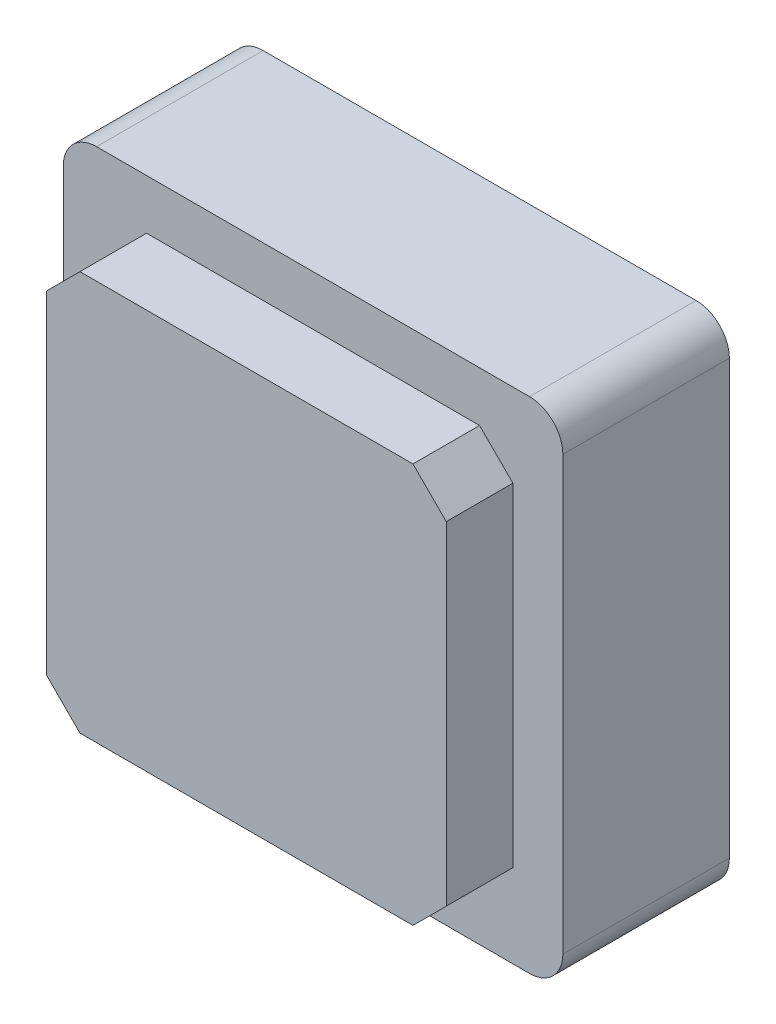
ISO-10303-21;
HEADER;
FILE_DESCRIPTION(('STEP AP214'),'2;1');
FILE_NAME('part.step','',(''),(''),'','','');
FILE_SCHEMA(('AUTOMOTIVE_DESIGN { 1 0 10303 214 1 1 1 1 }'));
ENDSEC;
DATA;
#1=APPLICATION_CONTEXT('core data for automotive mechanical design processes');
#2=APPLICATION_PROTOCOL_DEFINITION('international standard','automotive_design',2000,#1);
#3=PRODUCT_CONTEXT('',#1,'mechanical');
#4=PRODUCT('Part','Part','',(#3));
#5=PRODUCT_RELATED_PRODUCT_CATEGORY('part','',(#4));
#6=PRODUCT_DEFINITION_FORMATION('','',#4);
#7=PRODUCT_DEFINITION_CONTEXT('part definition',#1,'design');
#8=PRODUCT_DEFINITION('design','',#6,#7);
#9=PRODUCT_DEFINITION_SHAPE('','',#8);
#10=(LENGTH_UNIT() NAMED_UNIT(*) SI_UNIT(.MILLI.,.METRE.));
#11=(NAMED_UNIT(*) PLANE_ANGLE_UNIT() SI_UNIT($,.RADIAN.));
#12=(NAMED_UNIT(*) SI_UNIT($,.STERADIAN.) SOLID_ANGLE_UNIT());
#13=UNCERTAINTY_MEASURE_WITH_UNIT(LENGTH_MEASURE(1.E-05),#10,'distance_accuracy_value','');
#14=(GEOMETRIC_REPRESENTATION_CONTEXT(3) GLOBAL_UNCERTAINTY_ASSIGNED_CONTEXT((#13)) GLOBAL_UNIT_ASSIGNED_CONTEXT((#10,
#11,#12)) REPRESENTATION_CONTEXT('',''));
#15=CARTESIAN_POINT('',(0.,0.,0.));
#16=DIRECTION('',(0.,0.,1.));
#17=DIRECTION('',(1.,0.,0.));
#18=AXIS2_PLACEMENT_3D('',#15,#16,#17);
#19=CARTESIAN_POINT('',(0.,0.,5.));
#20=DIRECTION('',(0.,0.,-1.));
#21=DIRECTION('',(-1.,0.,0.));
#22=AXIS2_PLACEMENT_3D('',#19,#20,#21);
#23=PLANE('',#22);
#24=DIRECTION('',(0.,-1.,0.));
#25=VECTOR('',#24,1.);
#26=CARTESIAN_POINT('',(-7.5,-7.5,5.));
#27=LINE('',#26,#25);
#28=CARTESIAN_POINT('',(-7.5,6.5,5.));
#29=VERTEX_POINT('',#28);
#30=CARTESIAN_POINT('',(-7.5,-6.5,5.));
#31=VERTEX_POINT('',#30);
#32=EDGE_CURVE('E340',#29,#31,#27,.T.);
#33=ORIENTED_EDGE('',*,*,#32,.T.);
#34=CARTESIAN_POINT('',(-6.5,-6.5,5.));
#35=DIRECTION('',(0.,0.,-1.));
#36=DIRECTION('',(-1.,0.,0.));
#37=AXIS2_PLACEMENT_3D('',#34,#35,#36);
#38=CIRCLE('',#37,1.);
#39=CARTESIAN_POINT('',(-6.5,-7.5,5.));
#40=VERTEX_POINT('',#39);
#41=EDGE_CURVE('E220',#31,#40,#38,.F.);
#42=ORIENTED_EDGE('',*,*,#41,.T.);
#43=DIRECTION('',(1.,0.,0.));
#44=VECTOR('',#43,1.);
#45=CARTESIAN_POINT('',(-7.5,-7.5,5.));
#46=LINE('',#45,#44);
#47=CARTESIAN_POINT('',(6.5,-7.5,5.));
#48=VERTEX_POINT('',#47);
#49=EDGE_CURVE('E177',#40,#48,#46,.T.);
#50=ORIENTED_EDGE('',*,*,#49,.T.);
#51=CARTESIAN_POINT('',(6.5,-6.5,5.));
#52=DIRECTION('',(0.,0.,-1.));
#53=DIRECTION('',(-1.,0.,0.));
#54=AXIS2_PLACEMENT_3D('',#51,#52,#53);
#55=CIRCLE('',#54,1.);
#56=CARTESIAN_POINT('',(7.5,-6.5,5.));
#57=VERTEX_POINT('',#56);
#58=EDGE_CURVE('E217',#48,#57,#55,.F.);
#59=ORIENTED_EDGE('',*,*,#58,.T.);
#60=DIRECTION('',(0.,1.,0.));
#61=VECTOR('',#60,1.);
#62=CARTESIAN_POINT('',(7.5,-7.5,5.));
#63=LINE('',#62,#61);
#64=CARTESIAN_POINT('',(7.5,6.5,5.));
#65=VERTEX_POINT('',#64);
#66=EDGE_CURVE('E185',#57,#65,#63,.T.);
#67=ORIENTED_EDGE('',*,*,#66,.T.);
#68=CARTESIAN_POINT('',(6.5,6.5,5.));
#69=DIRECTION('',(0.,0.,-1.));
#70=DIRECTION('',(-1.,0.,0.));
#71=AXIS2_PLACEMENT_3D('',#68,#69,#70);
#72=CIRCLE('',#71,1.);
#73=CARTESIAN_POINT('',(6.5,7.5,5.));
#74=VERTEX_POINT('',#73);
#75=EDGE_CURVE('E214',#65,#74,#72,.F.);
#76=ORIENTED_EDGE('',*,*,#75,.T.);
#77=DIRECTION('',(-1.,0.,0.));
#78=VECTOR('',#77,1.);
#79=CARTESIAN_POINT('',(-7.5,7.5,5.));
#80=LINE('',#79,#78);
#81=CARTESIAN_POINT('',(-6.5,7.5,5.));
#82=VERTEX_POINT('',#81);
#83=EDGE_CURVE('E191',#74,#82,#80,.T.);
#84=ORIENTED_EDGE('',*,*,#83,.T.);
#85=CARTESIAN_POINT('',(-6.5,6.5,5.));
#86=DIRECTION('',(0.,0.,-1.));
#87=DIRECTION('',(-1.,0.,0.));
#88=AXIS2_PLACEMENT_3D('',#85,#86,#87);
#89=CIRCLE('',#88,1.);
#90=EDGE_CURVE('E211',#82,#29,#89,.F.);
#91=ORIENTED_EDGE('',*,*,#90,.T.);
#92=EDGE_LOOP('',(#33,#42,#50,#59,#67,#76,#84,#91));
#93=FACE_BOUND('',#92,.T.);
#94=DIRECTION('',(0.,1.,0.));
#95=VECTOR('',#94,1.);
#96=CARTESIAN_POINT('',(6.,-6.,5.));
#97=LINE('',#96,#95);
#98=CARTESIAN_POINT('',(6.,-5.,5.));
#99=VERTEX_POINT('',#98);
#100=CARTESIAN_POINT('',(6.,4.99999999999999,5.));
#101=VERTEX_POINT('',#100);
#102=EDGE_CURVE('E288',#99,#101,#97,.T.);
#103=ORIENTED_EDGE('',*,*,#102,.F.);
#104=DIRECTION('',(0.707106781186549,0.707106781186546,0.));
#105=VECTOR('',#104,1.);
#106=CARTESIAN_POINT('',(5.49999999999999,-5.50000000000001,5.));
#107=LINE('',#106,#105);
#108=CARTESIAN_POINT('',(4.99999999999999,-6.,5.));
#109=VERTEX_POINT('',#108);
#110=EDGE_CURVE('E283',#99,#109,#107,.F.);
#111=ORIENTED_EDGE('',*,*,#110,.T.);
#112=DIRECTION('',(1.,0.,0.));
#113=VECTOR('',#112,1.);
#114=CARTESIAN_POINT('',(-6.,-6.,5.));
#115=LINE('',#114,#113);
#116=CARTESIAN_POINT('',(-5.,-6.,5.));
#117=VERTEX_POINT('',#116);
#118=EDGE_CURVE('E317',#117,#109,#115,.T.);
#119=ORIENTED_EDGE('',*,*,#118,.F.);
#120=DIRECTION('',(0.707106781186546,-0.707106781186549,0.));
#121=VECTOR('',#120,1.);
#122=CARTESIAN_POINT('',(-5.50000000000001,-5.49999999999999,5.));
#123=LINE('',#122,#121);
#124=CARTESIAN_POINT('',(-6.,-5.,5.));
#125=VERTEX_POINT('',#124);
#126=EDGE_CURVE('E280',#117,#125,#123,.F.);
#127=ORIENTED_EDGE('',*,*,#126,.T.);
#128=DIRECTION('',(0.,-1.,0.));
#129=VECTOR('',#128,1.);
#130=CARTESIAN_POINT('',(-6.,-6.,5.));
#131=LINE('',#130,#129);
#132=CARTESIAN_POINT('',(-6.,5.,5.));
#133=VERTEX_POINT('',#132);
#134=EDGE_CURVE('E326',#133,#125,#131,.T.);
#135=ORIENTED_EDGE('',*,*,#134,.F.);
#136=DIRECTION('',(-0.707106781186549,-0.707106781186546,0.));
#137=VECTOR('',#136,1.);
#138=CARTESIAN_POINT('',(-5.49999999999999,5.50000000000001,5.));
#139=LINE('',#138,#137);
#140=CARTESIAN_POINT('',(-5.,6.,5.));
#141=VERTEX_POINT('',#140);
#142=EDGE_CURVE('E11',#133,#141,#139,.F.);
#143=ORIENTED_EDGE('',*,*,#142,.T.);
#144=DIRECTION('',(-1.,0.,0.));
#145=VECTOR('',#144,1.);
#146=CARTESIAN_POINT('',(-6.,6.,5.));
#147=LINE('',#146,#145);
#148=CARTESIAN_POINT('',(5.,6.,5.));
#149=VERTEX_POINT('',#148);
#150=EDGE_CURVE('E289',#149,#141,#147,.T.);
#151=ORIENTED_EDGE('',*,*,#150,.F.);
#152=DIRECTION('',(-0.707106781186546,0.707106781186549,0.));
#153=VECTOR('',#152,1.);
#154=CARTESIAN_POINT('',(5.50000000000001,5.49999999999999,5.));
#155=LINE('',#154,#153);
#156=EDGE_CURVE('E52',#149,#101,#155,.F.);
#157=ORIENTED_EDGE('',*,*,#156,.T.);
#158=EDGE_LOOP('',(#103,#111,#119,#127,#135,#143,#151,#157));
#159=FACE_BOUND('',#158,.T.);
#160=ADVANCED_FACE('F42',(#93,#159),#23,.F.);
#161=CARTESIAN_POINT('',(7.5,-7.5,5.));
#162=DIRECTION('',(-1.,0.,0.));
#163=DIRECTION('',(0.,0.,1.));
#164=AXIS2_PLACEMENT_3D('',#161,#162,#163);
#165=PLANE('',#164);
#166=ORIENTED_EDGE('',*,*,#66,.F.);
#167=DIRECTION('',(0.,0.,-1.));
#168=VECTOR('',#167,1.);
#169=CARTESIAN_POINT('',(7.5,-6.5,5.));
#170=LINE('',#169,#168);
#171=CARTESIAN_POINT('',(7.5,-6.5,0.));
#172=VERTEX_POINT('',#171);
#173=EDGE_CURVE('E226',#57,#172,#170,.T.);
#174=ORIENTED_EDGE('',*,*,#173,.T.);
#175=DIRECTION('',(0.,1.,0.));
#176=VECTOR('',#175,1.);
#177=CARTESIAN_POINT('',(7.5,-7.5,0.));
#178=LINE('',#177,#176);
#179=CARTESIAN_POINT('',(7.5,6.5,0.));
#180=VERTEX_POINT('',#179);
#181=EDGE_CURVE('E335',#172,#180,#178,.T.);
#182=ORIENTED_EDGE('',*,*,#181,.T.);
#183=DIRECTION('',(0.,0.,-1.));
#184=VECTOR('',#183,1.);
#185=CARTESIAN_POINT('',(7.5,6.5,5.));
#186=LINE('',#185,#184);
#187=EDGE_CURVE('E223',#180,#65,#186,.F.);
#188=ORIENTED_EDGE('',*,*,#187,.T.);
#189=EDGE_LOOP('',(#166,#174,#182,#188));
#190=FACE_BOUND('',#189,.T.);
#191=ADVANCED_FACE('F371',(#190),#165,.F.);
#192=CARTESIAN_POINT('',(-7.5,7.5,5.));
#193=DIRECTION('',(0.,-1.,0.));
#194=DIRECTION('',(0.,0.,-1.));
#195=AXIS2_PLACEMENT_3D('',#192,#193,#194);
#196=PLANE('',#195);
#197=ORIENTED_EDGE('',*,*,#83,.F.);
#198=DIRECTION('',(0.,0.,-1.));
#199=VECTOR('',#198,1.);
#200=CARTESIAN_POINT('',(6.5,7.5,5.));
#201=LINE('',#200,#199);
#202=CARTESIAN_POINT('',(6.5,7.5,0.));
#203=VERTEX_POINT('',#202);
#204=EDGE_CURVE('E233',#74,#203,#201,.T.);
#205=ORIENTED_EDGE('',*,*,#204,.T.);
#206=DIRECTION('',(-1.,0.,0.));
#207=VECTOR('',#206,1.);
#208=CARTESIAN_POINT('',(-7.5,7.5,0.));
#209=LINE('',#208,#207);
#210=CARTESIAN_POINT('',(-6.5,7.5,0.));
#211=VERTEX_POINT('',#210);
#212=EDGE_CURVE('E193',#203,#211,#209,.T.);
#213=ORIENTED_EDGE('',*,*,#212,.T.);
#214=DIRECTION('',(0.,0.,-1.));
#215=VECTOR('',#214,1.);
#216=CARTESIAN_POINT('',(-6.5,7.5,5.));
#217=LINE('',#216,#215);
#218=EDGE_CURVE('E230',#211,#82,#217,.F.);
#219=ORIENTED_EDGE('',*,*,#218,.T.);
#220=EDGE_LOOP('',(#197,#205,#213,#219));
#221=FACE_BOUND('',#220,.T.);
#222=ADVANCED_FACE('F354',(#221),#196,.F.);
#223=CARTESIAN_POINT('',(-7.5,-7.5,5.));
#224=DIRECTION('',(1.,0.,0.));
#225=DIRECTION('',(0.,0.,-1.));
#226=AXIS2_PLACEMENT_3D('',#223,#224,#225);
#227=PLANE('',#226);
#228=DIRECTION('',(0.,-1.,0.));
#229=VECTOR('',#228,1.);
#230=CARTESIAN_POINT('',(-7.5,-7.5,0.));
#231=LINE('',#230,#229);
#232=CARTESIAN_POINT('',(-7.5,6.5,0.));
#233=VERTEX_POINT('',#232);
#234=CARTESIAN_POINT('',(-7.5,-6.5,0.));
#235=VERTEX_POINT('',#234);
#236=EDGE_CURVE('E186',#233,#235,#231,.T.);
#237=ORIENTED_EDGE('',*,*,#236,.T.);
#238=DIRECTION('',(0.,0.,-1.));
#239=VECTOR('',#238,1.);
#240=CARTESIAN_POINT('',(-7.5,-6.5,5.));
#241=LINE('',#240,#239);
#242=EDGE_CURVE('E161',#235,#31,#241,.F.);
#243=ORIENTED_EDGE('',*,*,#242,.T.);
#244=ORIENTED_EDGE('',*,*,#32,.F.);
#245=DIRECTION('',(0.,0.,-1.));
#246=VECTOR('',#245,1.);
#247=CARTESIAN_POINT('',(-7.5,6.5,5.));
#248=LINE('',#247,#246);
#249=EDGE_CURVE('E167',#29,#233,#248,.T.);
#250=ORIENTED_EDGE('',*,*,#249,.T.);
#251=EDGE_LOOP('',(#237,#243,#244,#250));
#252=FACE_BOUND('',#251,.T.);
#253=ADVANCED_FACE('F363',(#252),#227,.F.);
#254=CARTESIAN_POINT('',(-7.5,-7.5,5.));
#255=DIRECTION('',(0.,1.,0.));
#256=DIRECTION('',(0.,0.,1.));
#257=AXIS2_PLACEMENT_3D('',#254,#255,#256);
#258=PLANE('',#257);
#259=ORIENTED_EDGE('',*,*,#49,.F.);
#260=DIRECTION('',(0.,0.,-1.));
#261=VECTOR('',#260,1.);
#262=CARTESIAN_POINT('',(-6.5,-7.5,5.));
#263=LINE('',#262,#261);
#264=CARTESIAN_POINT('',(-6.5,-7.5,0.));
#265=VERTEX_POINT('',#264);
#266=EDGE_CURVE('E160',#40,#265,#263,.T.);
#267=ORIENTED_EDGE('',*,*,#266,.T.);
#268=DIRECTION('',(1.,0.,0.));
#269=VECTOR('',#268,1.);
#270=CARTESIAN_POINT('',(-7.5,-7.5,0.));
#271=LINE('',#270,#269);
#272=CARTESIAN_POINT('',(6.5,-7.5,0.));
#273=VERTEX_POINT('',#272);
#274=EDGE_CURVE('E174',#265,#273,#271,.T.);
#275=ORIENTED_EDGE('',*,*,#274,.T.);
#276=DIRECTION('',(0.,0.,-1.));
#277=VECTOR('',#276,1.);
#278=CARTESIAN_POINT('',(6.5,-7.5,5.));
#279=LINE('',#278,#277);
#280=EDGE_CURVE('E180',#273,#48,#279,.F.);
#281=ORIENTED_EDGE('',*,*,#280,.T.);
#282=EDGE_LOOP('',(#259,#267,#275,#281));
#283=FACE_BOUND('',#282,.T.);
#284=ADVANCED_FACE('F173',(#283),#258,.F.);
#285=CARTESIAN_POINT('',(0.,0.,0.));
#286=DIRECTION('',(0.,0.,-1.));
#287=DIRECTION('',(-1.,0.,0.));
#288=AXIS2_PLACEMENT_3D('',#285,#286,#287);
#289=PLANE('',#288);
#290=CARTESIAN_POINT('',(-3.26092173505505,0.,0.));
#291=DIRECTION('',(0.,0.,-1.));
#292=DIRECTION('',(-1.,0.,0.));
#293=AXIS2_PLACEMENT_3D('',#290,#291,#292);
#294=CIRCLE('',#293,1.5);
#295=CARTESIAN_POINT('',(-4.76092173505505,0.,0.));
#296=VERTEX_POINT('',#295);
#297=EDGE_CURVE('E322',#296,#296,#294,.T.);
#298=ORIENTED_EDGE('',*,*,#297,.F.);
#299=EDGE_LOOP('',(#298));
#300=FACE_BOUND('',#299,.T.);
#301=ORIENTED_EDGE('',*,*,#274,.F.);
#302=CARTESIAN_POINT('',(-6.5,-6.5,0.));
#303=DIRECTION('',(0.,0.,-1.));
#304=DIRECTION('',(-1.,0.,0.));
#305=AXIS2_PLACEMENT_3D('',#302,#303,#304);
#306=CIRCLE('',#305,1.);
#307=EDGE_CURVE('E156',#265,#235,#306,.T.);
#308=ORIENTED_EDGE('',*,*,#307,.T.);
#309=ORIENTED_EDGE('',*,*,#236,.F.);
#310=CARTESIAN_POINT('',(-6.5,6.5,0.));
#311=DIRECTION('',(0.,0.,-1.));
#312=DIRECTION('',(-1.,0.,0.));
#313=AXIS2_PLACEMENT_3D('',#310,#311,#312);
#314=CIRCLE('',#313,1.);
#315=EDGE_CURVE('E179',#233,#211,#314,.T.);
#316=ORIENTED_EDGE('',*,*,#315,.T.);
#317=ORIENTED_EDGE('',*,*,#212,.F.);
#318=CARTESIAN_POINT('',(6.5,6.5,0.));
#319=DIRECTION('',(0.,0.,-1.));
#320=DIRECTION('',(-1.,0.,0.));
#321=AXIS2_PLACEMENT_3D('',#318,#319,#320);
#322=CIRCLE('',#321,1.);
#323=EDGE_CURVE('E201',#203,#180,#322,.T.);
#324=ORIENTED_EDGE('',*,*,#323,.T.);
#325=ORIENTED_EDGE('',*,*,#181,.F.);
#326=CARTESIAN_POINT('',(6.5,-6.5,0.));
#327=DIRECTION('',(0.,0.,-1.));
#328=DIRECTION('',(-1.,0.,0.));
#329=AXIS2_PLACEMENT_3D('',#326,#327,#328);
#330=CIRCLE('',#329,1.);
#331=EDGE_CURVE('E168',#172,#273,#330,.T.);
#332=ORIENTED_EDGE('',*,*,#331,.T.);
#333=EDGE_LOOP('',(#301,#308,#309,#316,#317,#324,#325,#332));
#334=FACE_BOUND('',#333,.T.);
#335=ADVANCED_FACE('F182',(#300,#334),#289,.T.);
#336=CARTESIAN_POINT('',(-6.5,-6.5,5.));
#337=DIRECTION('',(0.,0.,-1.));
#338=DIRECTION('',(-1.,0.,0.));
#339=AXIS2_PLACEMENT_3D('',#336,#337,#338);
#340=CYLINDRICAL_SURFACE('',#339,1.);
#341=ORIENTED_EDGE('',*,*,#41,.F.);
#342=ORIENTED_EDGE('',*,*,#242,.F.);
#343=ORIENTED_EDGE('',*,*,#307,.F.);
#344=ORIENTED_EDGE('',*,*,#266,.F.);
#345=EDGE_LOOP('',(#341,#342,#343,#344));
#346=FACE_BOUND('',#345,.T.);
#347=ADVANCED_FACE('F159',(#346),#340,.T.);
#348=CARTESIAN_POINT('',(6.5,-6.5,5.));
#349=DIRECTION('',(0.,0.,-1.));
#350=DIRECTION('',(-1.,0.,0.));
#351=AXIS2_PLACEMENT_3D('',#348,#349,#350);
#352=CYLINDRICAL_SURFACE('',#351,1.);
#353=ORIENTED_EDGE('',*,*,#58,.F.);
#354=ORIENTED_EDGE('',*,*,#280,.F.);
#355=ORIENTED_EDGE('',*,*,#331,.F.);
#356=ORIENTED_EDGE('',*,*,#173,.F.);
#357=EDGE_LOOP('',(#353,#354,#355,#356));
#358=FACE_BOUND('',#357,.T.);
#359=ADVANCED_FACE('F390',(#358),#352,.T.);
#360=CARTESIAN_POINT('',(6.5,6.5,5.));
#361=DIRECTION('',(0.,0.,-1.));
#362=DIRECTION('',(-1.,0.,0.));
#363=AXIS2_PLACEMENT_3D('',#360,#361,#362);
#364=CYLINDRICAL_SURFACE('',#363,1.);
#365=ORIENTED_EDGE('',*,*,#75,.F.);
#366=ORIENTED_EDGE('',*,*,#187,.F.);
#367=ORIENTED_EDGE('',*,*,#323,.F.);
#368=ORIENTED_EDGE('',*,*,#204,.F.);
#369=EDGE_LOOP('',(#365,#366,#367,#368));
#370=FACE_BOUND('',#369,.T.);
#371=ADVANCED_FACE('F404',(#370),#364,.T.);
#372=CARTESIAN_POINT('',(-6.5,6.5,5.));
#373=DIRECTION('',(0.,0.,-1.));
#374=DIRECTION('',(-1.,0.,0.));
#375=AXIS2_PLACEMENT_3D('',#372,#373,#374);
#376=CYLINDRICAL_SURFACE('',#375,1.);
#377=ORIENTED_EDGE('',*,*,#90,.F.);
#378=ORIENTED_EDGE('',*,*,#218,.F.);
#379=ORIENTED_EDGE('',*,*,#315,.F.);
#380=ORIENTED_EDGE('',*,*,#249,.F.);
#381=EDGE_LOOP('',(#377,#378,#379,#380));
#382=FACE_BOUND('',#381,.T.);
#383=ADVANCED_FACE('F358',(#382),#376,.T.);
#384=CARTESIAN_POINT('',(-3.26092173505505,0.,-0.3));
#385=DIRECTION('',(0.,0.,-1.));
#386=DIRECTION('',(-1.,0.,0.));
#387=AXIS2_PLACEMENT_3D('',#384,#385,#386);
#388=PLANE('',#387);
#389=CARTESIAN_POINT('',(-3.26092173505505,0.,-0.3));
#390=DIRECTION('',(0.,0.,-1.));
#391=DIRECTION('',(-1.,0.,0.));
#392=AXIS2_PLACEMENT_3D('',#389,#390,#391);
#393=CIRCLE('',#392,0.785857157145715);
#394=CARTESIAN_POINT('',(-4.04677889220076,0.,-0.3));
#395=VERTEX_POINT('',#394);
#396=EDGE_CURVE('E237',#395,#395,#393,.T.);
#397=ORIENTED_EDGE('',*,*,#396,.T.);
#398=EDGE_LOOP('',(#397));
#399=FACE_BOUND('',#398,.T.);
#400=ADVANCED_FACE('F383',(#399),#388,.T.);
#401=CARTESIAN_POINT('',(-3.26092173505505,0.,0.7));
#402=DIRECTION('',(0.,0.,1.));
#403=DIRECTION('',(1.,0.,0.));
#404=AXIS2_PLACEMENT_3D('',#401,#402,#403);
#405=DEGENERATE_TOROIDAL_SURFACE('',#404,0.785857157145715,1.,.T.);
#406=ORIENTED_EDGE('',*,*,#297,.T.);
#407=EDGE_LOOP('',(#406));
#408=FACE_BOUND('',#407,.T.);
#409=ORIENTED_EDGE('',*,*,#396,.F.);
#410=EDGE_LOOP('',(#409));
#411=FACE_BOUND('',#410,.T.);
#412=ADVANCED_FACE('F394',(#408,#411),#405,.T.);
#413=CARTESIAN_POINT('',(6.,-6.,7.));
#414=DIRECTION('',(-1.,0.,0.));
#415=DIRECTION('',(0.,0.,1.));
#416=AXIS2_PLACEMENT_3D('',#413,#414,#415);
#417=PLANE('',#416);
#418=DIRECTION('',(0.,1.,0.));
#419=VECTOR('',#418,1.);
#420=CARTESIAN_POINT('',(6.,-6.,7.));
#421=LINE('',#420,#419);
#422=CARTESIAN_POINT('',(6.,-5.,7.));
#423=VERTEX_POINT('',#422);
#424=CARTESIAN_POINT('',(6.,4.99999999999999,7.));
#425=VERTEX_POINT('',#424);
#426=EDGE_CURVE('E306',#423,#425,#421,.T.);
#427=ORIENTED_EDGE('',*,*,#426,.F.);
#428=DIRECTION('',(0.,0.,-1.));
#429=VECTOR('',#428,1.);
#430=CARTESIAN_POINT('',(6.,-5.,7.));
#431=LINE('',#430,#429);
#432=EDGE_CURVE('E270',#423,#99,#431,.T.);
#433=ORIENTED_EDGE('',*,*,#432,.T.);
#434=ORIENTED_EDGE('',*,*,#102,.T.);
#435=DIRECTION('',(0.,0.,1.));
#436=VECTOR('',#435,1.);
#437=CARTESIAN_POINT('',(6.,4.99999999999999,7.));
#438=LINE('',#437,#436);
#439=EDGE_CURVE('E267',#101,#425,#438,.T.);
#440=ORIENTED_EDGE('',*,*,#439,.T.);
#441=EDGE_LOOP('',(#427,#433,#434,#440));
#442=FACE_BOUND('',#441,.T.);
#443=ADVANCED_FACE('F292',(#442),#417,.F.);
#444=CARTESIAN_POINT('',(-6.,6.,7.));
#445=DIRECTION('',(0.,-1.,0.));
#446=DIRECTION('',(0.,0.,-1.));
#447=AXIS2_PLACEMENT_3D('',#444,#445,#446);
#448=PLANE('',#447);
#449=DIRECTION('',(-1.,0.,0.));
#450=VECTOR('',#449,1.);
#451=CARTESIAN_POINT('',(-6.,6.,7.));
#452=LINE('',#451,#450);
#453=CARTESIAN_POINT('',(5.,6.,7.));
#454=VERTEX_POINT('',#453);
#455=CARTESIAN_POINT('',(-5.,6.,7.));
#456=VERTEX_POINT('',#455);
#457=EDGE_CURVE('E304',#454,#456,#452,.T.);
#458=ORIENTED_EDGE('',*,*,#457,.F.);
#459=DIRECTION('',(0.,0.,-1.));
#460=VECTOR('',#459,1.);
#461=CARTESIAN_POINT('',(5.,6.,7.));
#462=LINE('',#461,#460);
#463=EDGE_CURVE('E277',#454,#149,#462,.T.);
#464=ORIENTED_EDGE('',*,*,#463,.T.);
#465=ORIENTED_EDGE('',*,*,#150,.T.);
#466=DIRECTION('',(0.,0.,1.));
#467=VECTOR('',#466,1.);
#468=CARTESIAN_POINT('',(-5.,6.,7.));
#469=LINE('',#468,#467);
#470=EDGE_CURVE('E274',#141,#456,#469,.T.);
#471=ORIENTED_EDGE('',*,*,#470,.T.);
#472=EDGE_LOOP('',(#458,#464,#465,#471));
#473=FACE_BOUND('',#472,.T.);
#474=ADVANCED_FACE('F308',(#473),#448,.F.);
#475=CARTESIAN_POINT('',(-6.,-6.,7.));
#476=DIRECTION('',(1.,0.,0.));
#477=DIRECTION('',(0.,0.,-1.));
#478=AXIS2_PLACEMENT_3D('',#475,#476,#477);
#479=PLANE('',#478);
#480=ORIENTED_EDGE('',*,*,#134,.T.);
#481=DIRECTION('',(0.,0.,1.));
#482=VECTOR('',#481,1.);
#483=CARTESIAN_POINT('',(-6.,-5.,7.));
#484=LINE('',#483,#482);
#485=CARTESIAN_POINT('',(-6.,-5.,7.));
#486=VERTEX_POINT('',#485);
#487=EDGE_CURVE('E252',#125,#486,#484,.T.);
#488=ORIENTED_EDGE('',*,*,#487,.T.);
#489=DIRECTION('',(0.,-1.,0.));
#490=VECTOR('',#489,1.);
#491=CARTESIAN_POINT('',(-6.,-6.,7.));
#492=LINE('',#491,#490);
#493=CARTESIAN_POINT('',(-6.,5.,7.));
#494=VERTEX_POINT('',#493);
#495=EDGE_CURVE('E311',#494,#486,#492,.T.);
#496=ORIENTED_EDGE('',*,*,#495,.F.);
#497=DIRECTION('',(0.,0.,-1.));
#498=VECTOR('',#497,1.);
#499=CARTESIAN_POINT('',(-6.,5.,7.));
#500=LINE('',#499,#498);
#501=EDGE_CURVE('E248',#494,#133,#500,.T.);
#502=ORIENTED_EDGE('',*,*,#501,.T.);
#503=EDGE_LOOP('',(#480,#488,#496,#502));
#504=FACE_BOUND('',#503,.T.);
#505=ADVANCED_FACE('F440',(#504),#479,.F.);
#506=CARTESIAN_POINT('',(-6.,-6.,7.));
#507=DIRECTION('',(0.,1.,0.));
#508=DIRECTION('',(0.,0.,1.));
#509=AXIS2_PLACEMENT_3D('',#506,#507,#508);
#510=PLANE('',#509);
#511=DIRECTION('',(1.,0.,0.));
#512=VECTOR('',#511,1.);
#513=CARTESIAN_POINT('',(-6.,-6.,7.));
#514=LINE('',#513,#512);
#515=CARTESIAN_POINT('',(-5.,-6.,7.));
#516=VERTEX_POINT('',#515);
#517=CARTESIAN_POINT('',(4.99999999999999,-6.,7.));
#518=VERTEX_POINT('',#517);
#519=EDGE_CURVE('E315',#516,#518,#514,.T.);
#520=ORIENTED_EDGE('',*,*,#519,.F.);
#521=DIRECTION('',(0.,0.,-1.));
#522=VECTOR('',#521,1.);
#523=CARTESIAN_POINT('',(-5.,-6.,7.));
#524=LINE('',#523,#522);
#525=EDGE_CURVE('E244',#516,#117,#524,.T.);
#526=ORIENTED_EDGE('',*,*,#525,.T.);
#527=ORIENTED_EDGE('',*,*,#118,.T.);
#528=DIRECTION('',(0.,0.,1.));
#529=VECTOR('',#528,1.);
#530=CARTESIAN_POINT('',(4.99999999999999,-6.,7.));
#531=LINE('',#530,#529);
#532=EDGE_CURVE('E241',#109,#518,#531,.T.);
#533=ORIENTED_EDGE('',*,*,#532,.T.);
#534=EDGE_LOOP('',(#520,#526,#527,#533));
#535=FACE_BOUND('',#534,.T.);
#536=ADVANCED_FACE('F446',(#535),#510,.F.);
#537=CARTESIAN_POINT('',(0.,0.,7.));
#538=DIRECTION('',(0.,0.,-1.));
#539=DIRECTION('',(-1.,0.,0.));
#540=AXIS2_PLACEMENT_3D('',#537,#538,#539);
#541=PLANE('',#540);
#542=ORIENTED_EDGE('',*,*,#495,.T.);
#543=DIRECTION('',(-0.707106781186546,0.707106781186549,0.));
#544=VECTOR('',#543,1.);
#545=CARTESIAN_POINT('',(-5.,-6.,7.));
#546=LINE('',#545,#544);
#547=EDGE_CURVE('E264',#486,#516,#546,.F.);
#548=ORIENTED_EDGE('',*,*,#547,.T.);
#549=ORIENTED_EDGE('',*,*,#519,.T.);
#550=DIRECTION('',(-0.707106781186549,-0.707106781186546,0.));
#551=VECTOR('',#550,1.);
#552=CARTESIAN_POINT('',(6.,-5.,7.));
#553=LINE('',#552,#551);
#554=EDGE_CURVE('E261',#518,#423,#553,.F.);
#555=ORIENTED_EDGE('',*,*,#554,.T.);
#556=ORIENTED_EDGE('',*,*,#426,.T.);
#557=DIRECTION('',(0.707106781186546,-0.707106781186549,0.));
#558=VECTOR('',#557,1.);
#559=CARTESIAN_POINT('',(5.,6.,7.));
#560=LINE('',#559,#558);
#561=EDGE_CURVE('E258',#425,#454,#560,.F.);
#562=ORIENTED_EDGE('',*,*,#561,.T.);
#563=ORIENTED_EDGE('',*,*,#457,.T.);
#564=DIRECTION('',(0.707106781186549,0.707106781186546,0.));
#565=VECTOR('',#564,1.);
#566=CARTESIAN_POINT('',(-6.,5.,7.));
#567=LINE('',#566,#565);
#568=EDGE_CURVE('E255',#456,#494,#567,.F.);
#569=ORIENTED_EDGE('',*,*,#568,.T.);
#570=EDGE_LOOP('',(#542,#548,#549,#555,#556,#562,#563,#569));
#571=FACE_BOUND('',#570,.T.);
#572=ADVANCED_FACE('F303',(#571),#541,.F.);
#573=CARTESIAN_POINT('',(-5.,-6.,7.));
#574=DIRECTION('',(0.707106781186549,0.707106781186546,0.));
#575=DIRECTION('',(0.,0.,-1.));
#576=AXIS2_PLACEMENT_3D('',#573,#574,#575);
#577=PLANE('',#576);
#578=ORIENTED_EDGE('',*,*,#547,.F.);
#579=ORIENTED_EDGE('',*,*,#487,.F.);
#580=ORIENTED_EDGE('',*,*,#126,.F.);
#581=ORIENTED_EDGE('',*,*,#525,.F.);
#582=EDGE_LOOP('',(#578,#579,#580,#581));
#583=FACE_BOUND('',#582,.T.);
#584=ADVANCED_FACE('F414',(#583),#577,.F.);
#585=CARTESIAN_POINT('',(6.,-5.,7.));
#586=DIRECTION('',(-0.707106781186546,0.707106781186549,0.));
#587=DIRECTION('',(0.,0.,-1.));
#588=AXIS2_PLACEMENT_3D('',#585,#586,#587);
#589=PLANE('',#588);
#590=ORIENTED_EDGE('',*,*,#554,.F.);
#591=ORIENTED_EDGE('',*,*,#532,.F.);
#592=ORIENTED_EDGE('',*,*,#110,.F.);
#593=ORIENTED_EDGE('',*,*,#432,.F.);
#594=EDGE_LOOP('',(#590,#591,#592,#593));
#595=FACE_BOUND('',#594,.T.);
#596=ADVANCED_FACE('F420',(#595),#589,.F.);
#597=CARTESIAN_POINT('',(5.,6.,7.));
#598=DIRECTION('',(-0.707106781186549,-0.707106781186546,0.));
#599=DIRECTION('',(0.,0.,-1.));
#600=AXIS2_PLACEMENT_3D('',#597,#598,#599);
#601=PLANE('',#600);
#602=ORIENTED_EDGE('',*,*,#561,.F.);
#603=ORIENTED_EDGE('',*,*,#439,.F.);
#604=ORIENTED_EDGE('',*,*,#156,.F.);
#605=ORIENTED_EDGE('',*,*,#463,.F.);
#606=EDGE_LOOP('',(#602,#603,#604,#605));
#607=FACE_BOUND('',#606,.T.);
#608=ADVANCED_FACE('F298',(#607),#601,.F.);
#609=CARTESIAN_POINT('',(-6.,5.,7.));
#610=DIRECTION('',(0.707106781186546,-0.707106781186549,0.));
#611=DIRECTION('',(0.,0.,-1.));
#612=AXIS2_PLACEMENT_3D('',#609,#610,#611);
#613=PLANE('',#612);
#614=ORIENTED_EDGE('',*,*,#568,.F.);
#615=ORIENTED_EDGE('',*,*,#470,.F.);
#616=ORIENTED_EDGE('',*,*,#142,.F.);
#617=ORIENTED_EDGE('',*,*,#501,.F.);
#618=EDGE_LOOP('',(#614,#615,#616,#617));
#619=FACE_BOUND('',#618,.T.);
#620=ADVANCED_FACE('F45',(#619),#613,.F.);
#621=CLOSED_SHELL('',(#160,#191,#222,#253,#284,#335,#347,#359,#371,#383,#400,#412,#443,#474,
#505,#536,#572,#584,#596,#608,#620));
#622=MANIFOLD_SOLID_BREP('B2',#621);
#623=ADVANCED_BREP_SHAPE_REPRESENTATION('',(#18,#622),#14);
#624=SHAPE_DEFINITION_REPRESENTATION(#9,#623);
ENDSEC;
END-ISO-10303-21;
